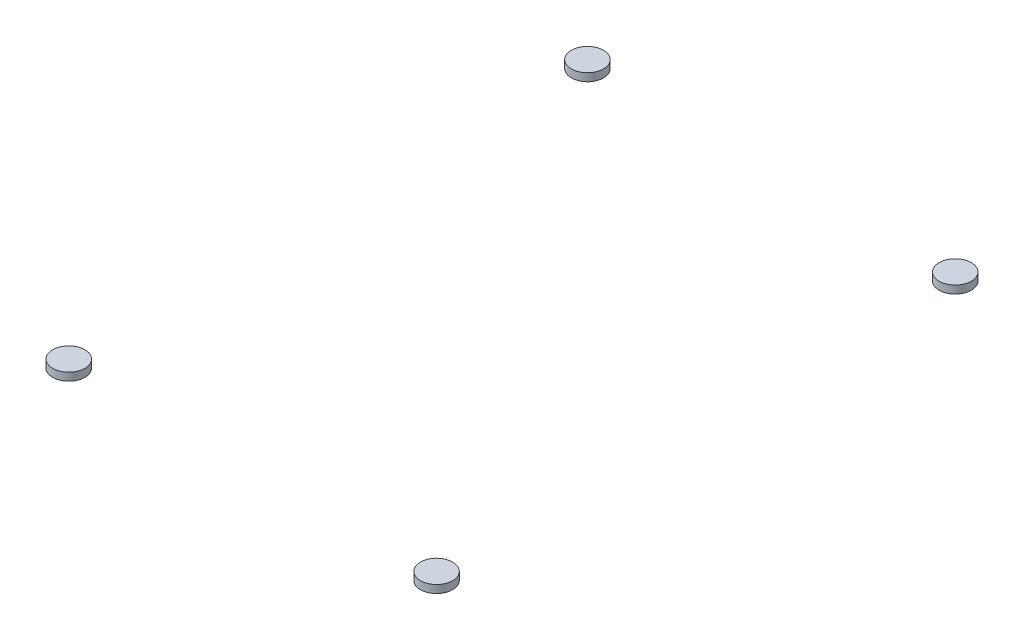
ISO-10303-21;
HEADER;
FILE_DESCRIPTION(('STEP AP214'),'2;1');
FILE_NAME('part.step','',(''),(''),'','','');
FILE_SCHEMA(('AUTOMOTIVE_DESIGN { 1 0 10303 214 1 1 1 1 }'));
ENDSEC;
DATA;
#1=APPLICATION_CONTEXT('core data for automotive mechanical design processes');
#2=APPLICATION_PROTOCOL_DEFINITION('international standard','automotive_design',2000,#1);
#3=PRODUCT_CONTEXT('',#1,'mechanical');
#4=PRODUCT('Part','Part','',(#3));
#5=PRODUCT_RELATED_PRODUCT_CATEGORY('part','',(#4));
#6=PRODUCT_DEFINITION_FORMATION('','',#4);
#7=PRODUCT_DEFINITION_CONTEXT('part definition',#1,'design');
#8=PRODUCT_DEFINITION('design','',#6,#7);
#9=PRODUCT_DEFINITION_SHAPE('','',#8);
#10=(LENGTH_UNIT() NAMED_UNIT(*) SI_UNIT(.MILLI.,.METRE.));
#11=(NAMED_UNIT(*) PLANE_ANGLE_UNIT() SI_UNIT($,.RADIAN.));
#12=(NAMED_UNIT(*) SI_UNIT($,.STERADIAN.) SOLID_ANGLE_UNIT());
#13=UNCERTAINTY_MEASURE_WITH_UNIT(LENGTH_MEASURE(1.E-05),#10,'distance_accuracy_value','');
#14=(GEOMETRIC_REPRESENTATION_CONTEXT(3) GLOBAL_UNCERTAINTY_ASSIGNED_CONTEXT((#13)) GLOBAL_UNIT_ASSIGNED_CONTEXT((#10,
#11,#12)) REPRESENTATION_CONTEXT('',''));
#15=CARTESIAN_POINT('',(0.,0.,0.));
#16=DIRECTION('',(0.,0.,1.));
#17=DIRECTION('',(1.,0.,0.));
#18=AXIS2_PLACEMENT_3D('',#15,#16,#17);
#19=CARTESIAN_POINT('',(23.4,1.,18.));
#20=DIRECTION('',(0.,-1.,0.));
#21=DIRECTION('',(0.,0.,-1.));
#22=AXIS2_PLACEMENT_3D('',#19,#20,#21);
#23=CYLINDRICAL_SURFACE('',#22,2.05);
#24=CARTESIAN_POINT('',(23.4,1.,18.));
#25=DIRECTION('',(0.,1.,0.));
#26=DIRECTION('',(0.,0.,1.));
#27=AXIS2_PLACEMENT_3D('',#24,#25,#26);
#28=CIRCLE('',#27,2.05);
#29=CARTESIAN_POINT('',(23.4,1.,20.05));
#30=VERTEX_POINT('',#29);
#31=EDGE_CURVE('E11',#30,#30,#28,.T.);
#32=ORIENTED_EDGE('',*,*,#31,.F.);
#33=EDGE_LOOP('',(#32));
#34=FACE_BOUND('',#33,.T.);
#35=CARTESIAN_POINT('',(23.4,0.,18.));
#36=DIRECTION('',(0.,1.,0.));
#37=DIRECTION('',(0.,0.,1.));
#38=AXIS2_PLACEMENT_3D('',#35,#36,#37);
#39=CIRCLE('',#38,2.05);
#40=CARTESIAN_POINT('',(23.4,0.,20.05));
#41=VERTEX_POINT('',#40);
#42=EDGE_CURVE('E55',#41,#41,#39,.T.);
#43=ORIENTED_EDGE('',*,*,#42,.T.);
#44=EDGE_LOOP('',(#43));
#45=FACE_BOUND('',#44,.T.);
#46=ADVANCED_FACE('F52',(#34,#45),#23,.T.);
#47=CARTESIAN_POINT('',(23.4,1.,18.));
#48=DIRECTION('',(0.,1.,0.));
#49=DIRECTION('',(0.,0.,1.));
#50=AXIS2_PLACEMENT_3D('',#47,#48,#49);
#51=PLANE('',#50);
#52=ORIENTED_EDGE('',*,*,#31,.T.);
#53=EDGE_LOOP('',(#52));
#54=FACE_BOUND('',#53,.T.);
#55=ADVANCED_FACE('F67',(#54),#51,.T.);
#56=CARTESIAN_POINT('',(23.4,0.,18.));
#57=DIRECTION('',(0.,1.,0.));
#58=DIRECTION('',(0.,0.,1.));
#59=AXIS2_PLACEMENT_3D('',#56,#57,#58);
#60=PLANE('',#59);
#61=ORIENTED_EDGE('',*,*,#42,.F.);
#62=EDGE_LOOP('',(#61));
#63=FACE_BOUND('',#62,.T.);
#64=ADVANCED_FACE('F65',(#63),#60,.F.);
#65=CLOSED_SHELL('',(#46,#55,#64));
#66=MANIFOLD_SOLID_BREP('B2',#65);
#67=CARTESIAN_POINT('',(23.4,1.,-48.));
#68=DIRECTION('',(0.,-1.,0.));
#69=DIRECTION('',(0.,0.,-1.));
#70=AXIS2_PLACEMENT_3D('',#67,#68,#69);
#71=CYLINDRICAL_SURFACE('',#70,2.05);
#72=CARTESIAN_POINT('',(23.4,1.,-48.));
#73=DIRECTION('',(0.,1.,0.));
#74=DIRECTION('',(0.,0.,1.));
#75=AXIS2_PLACEMENT_3D('',#72,#73,#74);
#76=CIRCLE('',#75,2.05);
#77=CARTESIAN_POINT('',(23.4,1.,-45.95));
#78=VERTEX_POINT('',#77);
#79=EDGE_CURVE('E51',#78,#78,#76,.T.);
#80=ORIENTED_EDGE('',*,*,#79,.F.);
#81=EDGE_LOOP('',(#80));
#82=FACE_BOUND('',#81,.T.);
#83=CARTESIAN_POINT('',(23.4,0.,-48.));
#84=DIRECTION('',(0.,1.,0.));
#85=DIRECTION('',(0.,0.,1.));
#86=AXIS2_PLACEMENT_3D('',#83,#84,#85);
#87=CIRCLE('',#86,2.05);
#88=CARTESIAN_POINT('',(23.4,0.,-45.95));
#89=VERTEX_POINT('',#88);
#90=EDGE_CURVE('E104',#89,#89,#87,.T.);
#91=ORIENTED_EDGE('',*,*,#90,.T.);
#92=EDGE_LOOP('',(#91));
#93=FACE_BOUND('',#92,.T.);
#94=ADVANCED_FACE('F101',(#82,#93),#71,.T.);
#95=CARTESIAN_POINT('',(23.4,1.,-48.));
#96=DIRECTION('',(0.,1.,0.));
#97=DIRECTION('',(0.,0.,1.));
#98=AXIS2_PLACEMENT_3D('',#95,#96,#97);
#99=PLANE('',#98);
#100=ORIENTED_EDGE('',*,*,#79,.T.);
#101=EDGE_LOOP('',(#100));
#102=FACE_BOUND('',#101,.T.);
#103=ADVANCED_FACE('F116',(#102),#99,.T.);
#104=CARTESIAN_POINT('',(23.4,0.,-48.));
#105=DIRECTION('',(0.,1.,0.));
#106=DIRECTION('',(0.,0.,1.));
#107=AXIS2_PLACEMENT_3D('',#104,#105,#106);
#108=PLANE('',#107);
#109=ORIENTED_EDGE('',*,*,#90,.F.);
#110=EDGE_LOOP('',(#109));
#111=FACE_BOUND('',#110,.T.);
#112=ADVANCED_FACE('F114',(#111),#108,.F.);
#113=CLOSED_SHELL('',(#94,#103,#112));
#114=MANIFOLD_SOLID_BREP('B6',#113);
#115=CARTESIAN_POINT('',(-23.4,1.,18.));
#116=DIRECTION('',(0.,-1.,0.));
#117=DIRECTION('',(0.,0.,-1.));
#118=AXIS2_PLACEMENT_3D('',#115,#116,#117);
#119=CYLINDRICAL_SURFACE('',#118,2.05);
#120=CARTESIAN_POINT('',(-23.4,1.,18.));
#121=DIRECTION('',(0.,1.,0.));
#122=DIRECTION('',(0.,0.,1.));
#123=AXIS2_PLACEMENT_3D('',#120,#121,#122);
#124=CIRCLE('',#123,2.05);
#125=CARTESIAN_POINT('',(-23.4,1.,20.05));
#126=VERTEX_POINT('',#125);
#127=EDGE_CURVE('E100',#126,#126,#124,.T.);
#128=ORIENTED_EDGE('',*,*,#127,.F.);
#129=EDGE_LOOP('',(#128));
#130=FACE_BOUND('',#129,.T.);
#131=CARTESIAN_POINT('',(-23.4,0.,18.));
#132=DIRECTION('',(0.,1.,0.));
#133=DIRECTION('',(0.,0.,1.));
#134=AXIS2_PLACEMENT_3D('',#131,#132,#133);
#135=CIRCLE('',#134,2.05);
#136=CARTESIAN_POINT('',(-23.4,0.,20.05));
#137=VERTEX_POINT('',#136);
#138=EDGE_CURVE('E152',#137,#137,#135,.T.);
#139=ORIENTED_EDGE('',*,*,#138,.T.);
#140=EDGE_LOOP('',(#139));
#141=FACE_BOUND('',#140,.T.);
#142=ADVANCED_FACE('F149',(#130,#141),#119,.T.);
#143=CARTESIAN_POINT('',(-23.4,1.,18.));
#144=DIRECTION('',(0.,1.,0.));
#145=DIRECTION('',(0.,0.,1.));
#146=AXIS2_PLACEMENT_3D('',#143,#144,#145);
#147=PLANE('',#146);
#148=ORIENTED_EDGE('',*,*,#127,.T.);
#149=EDGE_LOOP('',(#148));
#150=FACE_BOUND('',#149,.T.);
#151=ADVANCED_FACE('F164',(#150),#147,.T.);
#152=CARTESIAN_POINT('',(-23.4,0.,18.));
#153=DIRECTION('',(0.,1.,0.));
#154=DIRECTION('',(0.,0.,1.));
#155=AXIS2_PLACEMENT_3D('',#152,#153,#154);
#156=PLANE('',#155);
#157=ORIENTED_EDGE('',*,*,#138,.F.);
#158=EDGE_LOOP('',(#157));
#159=FACE_BOUND('',#158,.T.);
#160=ADVANCED_FACE('F162',(#159),#156,.F.);
#161=CLOSED_SHELL('',(#142,#151,#160));
#162=MANIFOLD_SOLID_BREP('B46',#161);
#163=CARTESIAN_POINT('',(-23.4,1.,-48.));
#164=DIRECTION('',(0.,-1.,0.));
#165=DIRECTION('',(0.,0.,-1.));
#166=AXIS2_PLACEMENT_3D('',#163,#164,#165);
#167=CYLINDRICAL_SURFACE('',#166,2.05);
#168=CARTESIAN_POINT('',(-23.4,1.,-48.));
#169=DIRECTION('',(0.,1.,0.));
#170=DIRECTION('',(0.,0.,1.));
#171=AXIS2_PLACEMENT_3D('',#168,#169,#170);
#172=CIRCLE('',#171,2.05);
#173=CARTESIAN_POINT('',(-23.4,1.,-45.95));
#174=VERTEX_POINT('',#173);
#175=EDGE_CURVE('E148',#174,#174,#172,.T.);
#176=ORIENTED_EDGE('',*,*,#175,.F.);
#177=EDGE_LOOP('',(#176));
#178=FACE_BOUND('',#177,.T.);
#179=CARTESIAN_POINT('',(-23.4,0.,-48.));
#180=DIRECTION('',(0.,1.,0.));
#181=DIRECTION('',(0.,0.,1.));
#182=AXIS2_PLACEMENT_3D('',#179,#180,#181);
#183=CIRCLE('',#182,2.05);
#184=CARTESIAN_POINT('',(-23.4,0.,-45.95));
#185=VERTEX_POINT('',#184);
#186=EDGE_CURVE('E193',#185,#185,#183,.T.);
#187=ORIENTED_EDGE('',*,*,#186,.T.);
#188=EDGE_LOOP('',(#187));
#189=FACE_BOUND('',#188,.T.);
#190=ADVANCED_FACE('F190',(#178,#189),#167,.T.);
#191=CARTESIAN_POINT('',(-23.4,1.,-48.));
#192=DIRECTION('',(0.,1.,0.));
#193=DIRECTION('',(0.,0.,1.));
#194=AXIS2_PLACEMENT_3D('',#191,#192,#193);
#195=PLANE('',#194);
#196=ORIENTED_EDGE('',*,*,#175,.T.);
#197=EDGE_LOOP('',(#196));
#198=FACE_BOUND('',#197,.T.);
#199=ADVANCED_FACE('F207',(#198),#195,.T.);
#200=CARTESIAN_POINT('',(-23.4,0.,-48.));
#201=DIRECTION('',(0.,1.,0.));
#202=DIRECTION('',(0.,0.,1.));
#203=AXIS2_PLACEMENT_3D('',#200,#201,#202);
#204=PLANE('',#203);
#205=ORIENTED_EDGE('',*,*,#186,.F.);
#206=EDGE_LOOP('',(#205));
#207=FACE_BOUND('',#206,.T.);
#208=ADVANCED_FACE('F205',(#207),#204,.F.);
#209=CLOSED_SHELL('',(#190,#199,#208));
#210=MANIFOLD_SOLID_BREP('B95',#209);
#211=ADVANCED_BREP_SHAPE_REPRESENTATION('',(#18,#66,#114,#162,#210),#14);
#212=SHAPE_DEFINITION_REPRESENTATION(#9,#211);
ENDSEC;
END-ISO-10303-21;
